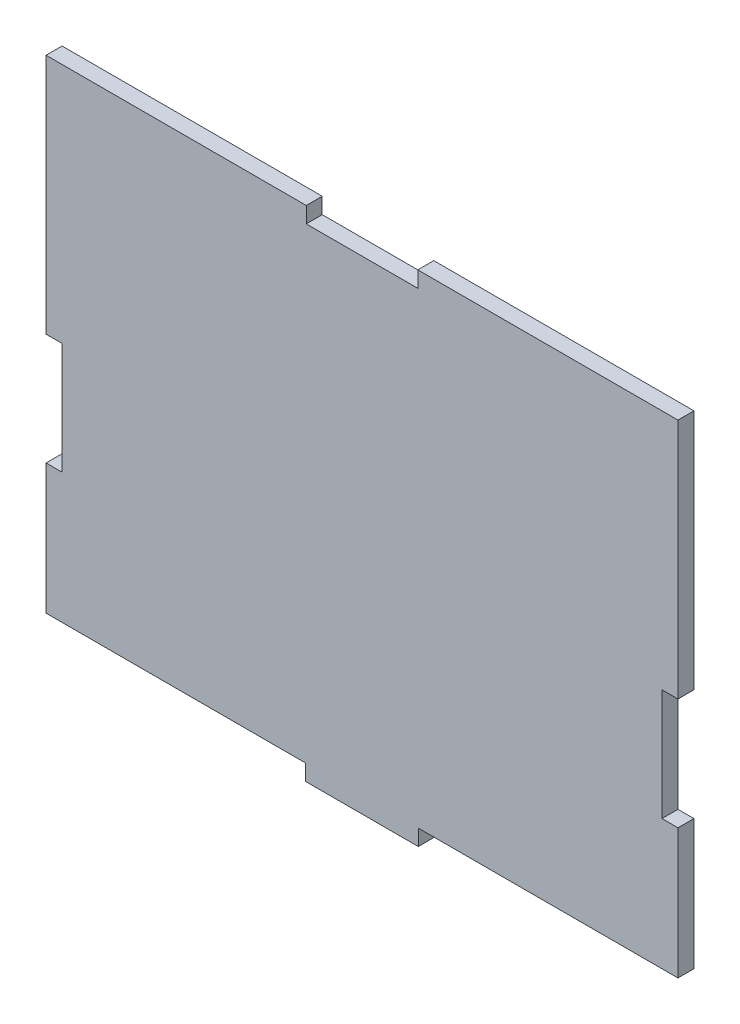
ISO-10303-21;
HEADER;
FILE_DESCRIPTION(('STEP AP214'),'2;1');
FILE_NAME('part.step','',(''),(''),'','','');
FILE_SCHEMA(('AUTOMOTIVE_DESIGN { 1 0 10303 214 1 1 1 1 }'));
ENDSEC;
DATA;
#1=APPLICATION_CONTEXT('core data for automotive mechanical design processes');
#2=APPLICATION_PROTOCOL_DEFINITION('international standard','automotive_design',2000,#1);
#3=PRODUCT_CONTEXT('',#1,'mechanical');
#4=PRODUCT('Part','Part','',(#3));
#5=PRODUCT_RELATED_PRODUCT_CATEGORY('part','',(#4));
#6=PRODUCT_DEFINITION_FORMATION('','',#4);
#7=PRODUCT_DEFINITION_CONTEXT('part definition',#1,'design');
#8=PRODUCT_DEFINITION('design','',#6,#7);
#9=PRODUCT_DEFINITION_SHAPE('','',#8);
#10=(LENGTH_UNIT() NAMED_UNIT(*) SI_UNIT(.MILLI.,.METRE.));
#11=(NAMED_UNIT(*) PLANE_ANGLE_UNIT() SI_UNIT($,.RADIAN.));
#12=(NAMED_UNIT(*) SI_UNIT($,.STERADIAN.) SOLID_ANGLE_UNIT());
#13=UNCERTAINTY_MEASURE_WITH_UNIT(LENGTH_MEASURE(1.E-05),#10,'distance_accuracy_value','');
#14=(GEOMETRIC_REPRESENTATION_CONTEXT(3) GLOBAL_UNCERTAINTY_ASSIGNED_CONTEXT((#13)) GLOBAL_UNIT_ASSIGNED_CONTEXT((#10,
#11,#12)) REPRESENTATION_CONTEXT('',''));
#15=CARTESIAN_POINT('',(0.,0.,0.));
#16=DIRECTION('',(0.,0.,1.));
#17=DIRECTION('',(1.,0.,0.));
#18=AXIS2_PLACEMENT_3D('',#15,#16,#17);
#19=CARTESIAN_POINT('',(85.,0.,4.3));
#20=DIRECTION('',(-1.,0.,0.));
#21=DIRECTION('',(0.,-1.,0.));
#22=AXIS2_PLACEMENT_3D('',#19,#20,#21);
#23=PLANE('',#22);
#24=DIRECTION('',(0.,1.,0.));
#25=VECTOR('',#24,1.);
#26=CARTESIAN_POINT('',(85.,0.,0.));
#27=LINE('',#26,#25);
#28=CARTESIAN_POINT('',(85.,0.,0.));
#29=VERTEX_POINT('',#28);
#30=CARTESIAN_POINT('',(85.,65.,0.));
#31=VERTEX_POINT('',#30);
#32=EDGE_CURVE('E204',#29,#31,#27,.T.);
#33=ORIENTED_EDGE('',*,*,#32,.T.);
#34=DIRECTION('',(0.,0.,-1.));
#35=VECTOR('',#34,1.);
#36=CARTESIAN_POINT('',(85.,65.,4.3));
#37=LINE('',#36,#35);
#38=CARTESIAN_POINT('',(85.,65.,4.3));
#39=VERTEX_POINT('',#38);
#40=EDGE_CURVE('E11',#39,#31,#37,.T.);
#41=ORIENTED_EDGE('',*,*,#40,.F.);
#42=DIRECTION('',(0.,1.,0.));
#43=VECTOR('',#42,1.);
#44=CARTESIAN_POINT('',(85.,0.,4.3));
#45=LINE('',#44,#43);
#46=CARTESIAN_POINT('',(85.,0.,4.3));
#47=VERTEX_POINT('',#46);
#48=EDGE_CURVE('E242',#47,#39,#45,.T.);
#49=ORIENTED_EDGE('',*,*,#48,.F.);
#50=DIRECTION('',(0.,0.,-1.));
#51=VECTOR('',#50,1.);
#52=CARTESIAN_POINT('',(85.,0.,4.3));
#53=LINE('',#52,#51);
#54=EDGE_CURVE('E200',#47,#29,#53,.T.);
#55=ORIENTED_EDGE('',*,*,#54,.T.);
#56=EDGE_LOOP('',(#33,#41,#49,#55));
#57=FACE_BOUND('',#56,.T.);
#58=ADVANCED_FACE('F36',(#57),#23,.F.);
#59=CARTESIAN_POINT('',(15.,65.,4.3));
#60=DIRECTION('',(0.,-1.,0.));
#61=DIRECTION('',(0.,0.,-1.));
#62=AXIS2_PLACEMENT_3D('',#59,#60,#61);
#63=PLANE('',#62);
#64=DIRECTION('',(-1.,0.,0.));
#65=VECTOR('',#64,1.);
#66=CARTESIAN_POINT('',(15.,65.,0.));
#67=LINE('',#66,#65);
#68=CARTESIAN_POINT('',(15.,65.,0.));
#69=VERTEX_POINT('',#68);
#70=EDGE_CURVE('E207',#31,#69,#67,.T.);
#71=ORIENTED_EDGE('',*,*,#70,.T.);
#72=DIRECTION('',(0.,0.,-1.));
#73=VECTOR('',#72,1.);
#74=CARTESIAN_POINT('',(15.,65.,4.3));
#75=LINE('',#74,#73);
#76=CARTESIAN_POINT('',(15.,65.,4.3));
#77=VERTEX_POINT('',#76);
#78=EDGE_CURVE('E44',#77,#69,#75,.T.);
#79=ORIENTED_EDGE('',*,*,#78,.F.);
#80=DIRECTION('',(-1.,0.,0.));
#81=VECTOR('',#80,1.);
#82=CARTESIAN_POINT('',(15.,65.,4.3));
#83=LINE('',#82,#81);
#84=EDGE_CURVE('E131',#39,#77,#83,.T.);
#85=ORIENTED_EDGE('',*,*,#84,.F.);
#86=ORIENTED_EDGE('',*,*,#40,.T.);
#87=EDGE_LOOP('',(#71,#79,#85,#86));
#88=FACE_BOUND('',#87,.T.);
#89=ADVANCED_FACE('F360',(#88),#63,.F.);
#90=CARTESIAN_POINT('',(15.,65.,4.3));
#91=DIRECTION('',(1.,0.,0.));
#92=DIRECTION('',(0.,0.,-1.));
#93=AXIS2_PLACEMENT_3D('',#90,#91,#92);
#94=PLANE('',#93);
#95=DIRECTION('',(0.,-1.,0.));
#96=VECTOR('',#95,1.);
#97=CARTESIAN_POINT('',(15.,65.,0.));
#98=LINE('',#97,#96);
#99=CARTESIAN_POINT('',(15.,60.7,0.));
#100=VERTEX_POINT('',#99);
#101=EDGE_CURVE('E209',#69,#100,#98,.T.);
#102=ORIENTED_EDGE('',*,*,#101,.T.);
#103=DIRECTION('',(0.,0.,-1.));
#104=VECTOR('',#103,1.);
#105=CARTESIAN_POINT('',(15.,60.7,4.3));
#106=LINE('',#105,#104);
#107=CARTESIAN_POINT('',(15.,60.7,4.3));
#108=VERTEX_POINT('',#107);
#109=EDGE_CURVE('E285',#108,#100,#106,.T.);
#110=ORIENTED_EDGE('',*,*,#109,.F.);
#111=DIRECTION('',(0.,-1.,0.));
#112=VECTOR('',#111,1.);
#113=CARTESIAN_POINT('',(15.,65.,4.3));
#114=LINE('',#113,#112);
#115=EDGE_CURVE('E293',#77,#108,#114,.T.);
#116=ORIENTED_EDGE('',*,*,#115,.F.);
#117=ORIENTED_EDGE('',*,*,#78,.T.);
#118=EDGE_LOOP('',(#102,#110,#116,#117));
#119=FACE_BOUND('',#118,.T.);
#120=ADVANCED_FACE('F291',(#119),#94,.F.);
#121=CARTESIAN_POINT('',(15.,60.7,4.3));
#122=DIRECTION('',(0.,-1.,0.));
#123=DIRECTION('',(0.,0.,-1.));
#124=AXIS2_PLACEMENT_3D('',#121,#122,#123);
#125=PLANE('',#124);
#126=DIRECTION('',(-1.,0.,0.));
#127=VECTOR('',#126,1.);
#128=CARTESIAN_POINT('',(15.,60.7,0.));
#129=LINE('',#128,#127);
#130=CARTESIAN_POINT('',(-15.,60.7,0.));
#131=VERTEX_POINT('',#130);
#132=EDGE_CURVE('E211',#100,#131,#129,.T.);
#133=ORIENTED_EDGE('',*,*,#132,.T.);
#134=DIRECTION('',(0.,0.,-1.));
#135=VECTOR('',#134,1.);
#136=CARTESIAN_POINT('',(-15.,60.7,4.3));
#137=LINE('',#136,#135);
#138=CARTESIAN_POINT('',(-15.,60.7,4.3));
#139=VERTEX_POINT('',#138);
#140=EDGE_CURVE('E282',#139,#131,#137,.T.);
#141=ORIENTED_EDGE('',*,*,#140,.F.);
#142=DIRECTION('',(-1.,0.,0.));
#143=VECTOR('',#142,1.);
#144=CARTESIAN_POINT('',(15.,60.7,4.3));
#145=LINE('',#144,#143);
#146=EDGE_CURVE('E311',#108,#139,#145,.T.);
#147=ORIENTED_EDGE('',*,*,#146,.F.);
#148=ORIENTED_EDGE('',*,*,#109,.T.);
#149=EDGE_LOOP('',(#133,#141,#147,#148));
#150=FACE_BOUND('',#149,.T.);
#151=ADVANCED_FACE('F302',(#150),#125,.F.);
#152=CARTESIAN_POINT('',(-15.,65.,4.3));
#153=DIRECTION('',(-1.,0.,0.));
#154=DIRECTION('',(0.,0.,1.));
#155=AXIS2_PLACEMENT_3D('',#152,#153,#154);
#156=PLANE('',#155);
#157=DIRECTION('',(0.,1.,0.));
#158=VECTOR('',#157,1.);
#159=CARTESIAN_POINT('',(-15.,65.,0.));
#160=LINE('',#159,#158);
#161=CARTESIAN_POINT('',(-15.,65.,0.));
#162=VERTEX_POINT('',#161);
#163=EDGE_CURVE('E213',#131,#162,#160,.T.);
#164=ORIENTED_EDGE('',*,*,#163,.T.);
#165=DIRECTION('',(0.,0.,-1.));
#166=VECTOR('',#165,1.);
#167=CARTESIAN_POINT('',(-15.,65.,4.3));
#168=LINE('',#167,#166);
#169=CARTESIAN_POINT('',(-15.,65.,4.3));
#170=VERTEX_POINT('',#169);
#171=EDGE_CURVE('E279',#170,#162,#168,.T.);
#172=ORIENTED_EDGE('',*,*,#171,.F.);
#173=DIRECTION('',(0.,1.,0.));
#174=VECTOR('',#173,1.);
#175=CARTESIAN_POINT('',(-15.,65.,4.3));
#176=LINE('',#175,#174);
#177=EDGE_CURVE('E308',#139,#170,#176,.T.);
#178=ORIENTED_EDGE('',*,*,#177,.F.);
#179=ORIENTED_EDGE('',*,*,#140,.T.);
#180=EDGE_LOOP('',(#164,#172,#178,#179));
#181=FACE_BOUND('',#180,.T.);
#182=ADVANCED_FACE('F306',(#181),#156,.F.);
#183=CARTESIAN_POINT('',(-85.,65.,4.3));
#184=DIRECTION('',(0.,-1.,0.));
#185=DIRECTION('',(0.,0.,-1.));
#186=AXIS2_PLACEMENT_3D('',#183,#184,#185);
#187=PLANE('',#186);
#188=DIRECTION('',(-1.,0.,0.));
#189=VECTOR('',#188,1.);
#190=CARTESIAN_POINT('',(-85.,65.,0.));
#191=LINE('',#190,#189);
#192=CARTESIAN_POINT('',(-85.,65.,0.));
#193=VERTEX_POINT('',#192);
#194=EDGE_CURVE('E215',#162,#193,#191,.T.);
#195=ORIENTED_EDGE('',*,*,#194,.T.);
#196=DIRECTION('',(0.,0.,-1.));
#197=VECTOR('',#196,1.);
#198=CARTESIAN_POINT('',(-85.,65.,4.3));
#199=LINE('',#198,#197);
#200=CARTESIAN_POINT('',(-85.,65.,4.3));
#201=VERTEX_POINT('',#200);
#202=EDGE_CURVE('E276',#201,#193,#199,.T.);
#203=ORIENTED_EDGE('',*,*,#202,.F.);
#204=DIRECTION('',(-1.,0.,0.));
#205=VECTOR('',#204,1.);
#206=CARTESIAN_POINT('',(-85.,65.,4.3));
#207=LINE('',#206,#205);
#208=EDGE_CURVE('E310',#170,#201,#207,.T.);
#209=ORIENTED_EDGE('',*,*,#208,.F.);
#210=ORIENTED_EDGE('',*,*,#171,.T.);
#211=EDGE_LOOP('',(#195,#203,#209,#210));
#212=FACE_BOUND('',#211,.T.);
#213=ADVANCED_FACE('F373',(#212),#187,.F.);
#214=CARTESIAN_POINT('',(-85.,0.,4.3));
#215=DIRECTION('',(1.,0.,0.));
#216=DIRECTION('',(0.,1.,0.));
#217=AXIS2_PLACEMENT_3D('',#214,#215,#216);
#218=PLANE('',#217);
#219=DIRECTION('',(0.,-1.,0.));
#220=VECTOR('',#219,1.);
#221=CARTESIAN_POINT('',(-85.,0.,0.));
#222=LINE('',#221,#220);
#223=CARTESIAN_POINT('',(-85.,0.,0.));
#224=VERTEX_POINT('',#223);
#225=EDGE_CURVE('E217',#193,#224,#222,.T.);
#226=ORIENTED_EDGE('',*,*,#225,.T.);
#227=DIRECTION('',(0.,0.,-1.));
#228=VECTOR('',#227,1.);
#229=CARTESIAN_POINT('',(-85.,0.,4.3));
#230=LINE('',#229,#228);
#231=CARTESIAN_POINT('',(-85.,0.,4.3));
#232=VERTEX_POINT('',#231);
#233=EDGE_CURVE('E273',#232,#224,#230,.T.);
#234=ORIENTED_EDGE('',*,*,#233,.F.);
#235=DIRECTION('',(0.,-1.,0.));
#236=VECTOR('',#235,1.);
#237=CARTESIAN_POINT('',(-85.,0.,4.3));
#238=LINE('',#237,#236);
#239=EDGE_CURVE('E313',#201,#232,#238,.T.);
#240=ORIENTED_EDGE('',*,*,#239,.F.);
#241=ORIENTED_EDGE('',*,*,#202,.T.);
#242=EDGE_LOOP('',(#226,#234,#240,#241));
#243=FACE_BOUND('',#242,.T.);
#244=ADVANCED_FACE('F376',(#243),#218,.F.);
#245=CARTESIAN_POINT('',(-85.,0.,4.3));
#246=DIRECTION('',(0.,1.,0.));
#247=DIRECTION('',(0.,0.,1.));
#248=AXIS2_PLACEMENT_3D('',#245,#246,#247);
#249=PLANE('',#248);
#250=DIRECTION('',(1.,0.,0.));
#251=VECTOR('',#250,1.);
#252=CARTESIAN_POINT('',(-85.,0.,0.));
#253=LINE('',#252,#251);
#254=CARTESIAN_POINT('',(-80.7,0.,0.));
#255=VERTEX_POINT('',#254);
#256=EDGE_CURVE('E219',#224,#255,#253,.T.);
#257=ORIENTED_EDGE('',*,*,#256,.T.);
#258=DIRECTION('',(0.,0.,-1.));
#259=VECTOR('',#258,1.);
#260=CARTESIAN_POINT('',(-80.7,0.,4.3));
#261=LINE('',#260,#259);
#262=CARTESIAN_POINT('',(-80.7,0.,4.3));
#263=VERTEX_POINT('',#262);
#264=EDGE_CURVE('E270',#263,#255,#261,.T.);
#265=ORIENTED_EDGE('',*,*,#264,.F.);
#266=DIRECTION('',(1.,0.,0.));
#267=VECTOR('',#266,1.);
#268=CARTESIAN_POINT('',(-85.,0.,4.3));
#269=LINE('',#268,#267);
#270=EDGE_CURVE('E319',#232,#263,#269,.T.);
#271=ORIENTED_EDGE('',*,*,#270,.F.);
#272=ORIENTED_EDGE('',*,*,#233,.T.);
#273=EDGE_LOOP('',(#257,#265,#271,#272));
#274=FACE_BOUND('',#273,.T.);
#275=ADVANCED_FACE('F380',(#274),#249,.F.);
#276=CARTESIAN_POINT('',(-80.7,0.,4.3));
#277=DIRECTION('',(1.,0.,0.));
#278=DIRECTION('',(0.,0.,-1.));
#279=AXIS2_PLACEMENT_3D('',#276,#277,#278);
#280=PLANE('',#279);
#281=DIRECTION('',(0.,-1.,0.));
#282=VECTOR('',#281,1.);
#283=CARTESIAN_POINT('',(-80.7,0.,0.));
#284=LINE('',#283,#282);
#285=CARTESIAN_POINT('',(-80.7,-30.,0.));
#286=VERTEX_POINT('',#285);
#287=EDGE_CURVE('E221',#255,#286,#284,.T.);
#288=ORIENTED_EDGE('',*,*,#287,.T.);
#289=DIRECTION('',(0.,0.,-1.));
#290=VECTOR('',#289,1.);
#291=CARTESIAN_POINT('',(-80.7,-30.,4.3));
#292=LINE('',#291,#290);
#293=CARTESIAN_POINT('',(-80.7,-30.,4.3));
#294=VERTEX_POINT('',#293);
#295=EDGE_CURVE('E267',#294,#286,#292,.T.);
#296=ORIENTED_EDGE('',*,*,#295,.F.);
#297=DIRECTION('',(0.,-1.,0.));
#298=VECTOR('',#297,1.);
#299=CARTESIAN_POINT('',(-80.7,0.,4.3));
#300=LINE('',#299,#298);
#301=EDGE_CURVE('E321',#263,#294,#300,.T.);
#302=ORIENTED_EDGE('',*,*,#301,.F.);
#303=ORIENTED_EDGE('',*,*,#264,.T.);
#304=EDGE_LOOP('',(#288,#296,#302,#303));
#305=FACE_BOUND('',#304,.T.);
#306=ADVANCED_FACE('F384',(#305),#280,.F.);
#307=CARTESIAN_POINT('',(-85.,-30.,4.3));
#308=DIRECTION('',(0.,-1.,0.));
#309=DIRECTION('',(0.,0.,-1.));
#310=AXIS2_PLACEMENT_3D('',#307,#308,#309);
#311=PLANE('',#310);
#312=DIRECTION('',(-1.,0.,0.));
#313=VECTOR('',#312,1.);
#314=CARTESIAN_POINT('',(-85.,-30.,0.));
#315=LINE('',#314,#313);
#316=CARTESIAN_POINT('',(-85.,-30.,0.));
#317=VERTEX_POINT('',#316);
#318=EDGE_CURVE('E223',#286,#317,#315,.T.);
#319=ORIENTED_EDGE('',*,*,#318,.T.);
#320=DIRECTION('',(0.,0.,-1.));
#321=VECTOR('',#320,1.);
#322=CARTESIAN_POINT('',(-85.,-30.,4.3));
#323=LINE('',#322,#321);
#324=CARTESIAN_POINT('',(-85.,-30.,4.3));
#325=VERTEX_POINT('',#324);
#326=EDGE_CURVE('E264',#325,#317,#323,.T.);
#327=ORIENTED_EDGE('',*,*,#326,.F.);
#328=DIRECTION('',(-1.,0.,0.));
#329=VECTOR('',#328,1.);
#330=CARTESIAN_POINT('',(-85.,-30.,4.3));
#331=LINE('',#330,#329);
#332=EDGE_CURVE('E323',#294,#325,#331,.T.);
#333=ORIENTED_EDGE('',*,*,#332,.F.);
#334=ORIENTED_EDGE('',*,*,#295,.T.);
#335=EDGE_LOOP('',(#319,#327,#333,#334));
#336=FACE_BOUND('',#335,.T.);
#337=ADVANCED_FACE('F388',(#336),#311,.F.);
#338=CARTESIAN_POINT('',(-85.,-65.,4.3));
#339=DIRECTION('',(1.,0.,0.));
#340=DIRECTION('',(0.,1.,0.));
#341=AXIS2_PLACEMENT_3D('',#338,#339,#340);
#342=PLANE('',#341);
#343=DIRECTION('',(0.,-1.,0.));
#344=VECTOR('',#343,1.);
#345=CARTESIAN_POINT('',(-85.,-65.,0.));
#346=LINE('',#345,#344);
#347=CARTESIAN_POINT('',(-85.,-65.,0.));
#348=VERTEX_POINT('',#347);
#349=EDGE_CURVE('E225',#317,#348,#346,.T.);
#350=ORIENTED_EDGE('',*,*,#349,.T.);
#351=DIRECTION('',(0.,0.,-1.));
#352=VECTOR('',#351,1.);
#353=CARTESIAN_POINT('',(-85.,-65.,4.3));
#354=LINE('',#353,#352);
#355=CARTESIAN_POINT('',(-85.,-65.,4.3));
#356=VERTEX_POINT('',#355);
#357=EDGE_CURVE('E261',#356,#348,#354,.T.);
#358=ORIENTED_EDGE('',*,*,#357,.F.);
#359=DIRECTION('',(0.,-1.,0.));
#360=VECTOR('',#359,1.);
#361=CARTESIAN_POINT('',(-85.,-65.,4.3));
#362=LINE('',#361,#360);
#363=EDGE_CURVE('E325',#325,#356,#362,.T.);
#364=ORIENTED_EDGE('',*,*,#363,.F.);
#365=ORIENTED_EDGE('',*,*,#326,.T.);
#366=EDGE_LOOP('',(#350,#358,#364,#365));
#367=FACE_BOUND('',#366,.T.);
#368=ADVANCED_FACE('F392',(#367),#342,.F.);
#369=CARTESIAN_POINT('',(-85.,-65.,4.3));
#370=DIRECTION('',(0.,1.,0.));
#371=DIRECTION('',(0.,0.,1.));
#372=AXIS2_PLACEMENT_3D('',#369,#370,#371);
#373=PLANE('',#372);
#374=DIRECTION('',(1.,0.,0.));
#375=VECTOR('',#374,1.);
#376=CARTESIAN_POINT('',(-85.,-65.,0.));
#377=LINE('',#376,#375);
#378=CARTESIAN_POINT('',(-15.15,-65.,0.));
#379=VERTEX_POINT('',#378);
#380=EDGE_CURVE('E227',#348,#379,#377,.T.);
#381=ORIENTED_EDGE('',*,*,#380,.T.);
#382=DIRECTION('',(0.,0.,-1.));
#383=VECTOR('',#382,1.);
#384=CARTESIAN_POINT('',(-15.15,-65.,4.3));
#385=LINE('',#384,#383);
#386=CARTESIAN_POINT('',(-15.15,-65.,4.3));
#387=VERTEX_POINT('',#386);
#388=EDGE_CURVE('E258',#387,#379,#385,.T.);
#389=ORIENTED_EDGE('',*,*,#388,.F.);
#390=DIRECTION('',(1.,0.,0.));
#391=VECTOR('',#390,1.);
#392=CARTESIAN_POINT('',(-85.,-65.,4.3));
#393=LINE('',#392,#391);
#394=EDGE_CURVE('E327',#356,#387,#393,.T.);
#395=ORIENTED_EDGE('',*,*,#394,.F.);
#396=ORIENTED_EDGE('',*,*,#357,.T.);
#397=EDGE_LOOP('',(#381,#389,#395,#396));
#398=FACE_BOUND('',#397,.T.);
#399=ADVANCED_FACE('F396',(#398),#373,.F.);
#400=CARTESIAN_POINT('',(-15.15,-65.,4.3));
#401=DIRECTION('',(1.,0.,0.));
#402=DIRECTION('',(0.,0.,-1.));
#403=AXIS2_PLACEMENT_3D('',#400,#401,#402);
#404=PLANE('',#403);
#405=DIRECTION('',(0.,-1.,0.));
#406=VECTOR('',#405,1.);
#407=CARTESIAN_POINT('',(-15.15,-65.,0.));
#408=LINE('',#407,#406);
#409=CARTESIAN_POINT('',(-15.15,-69.3,0.));
#410=VERTEX_POINT('',#409);
#411=EDGE_CURVE('E229',#379,#410,#408,.T.);
#412=ORIENTED_EDGE('',*,*,#411,.T.);
#413=DIRECTION('',(0.,0.,-1.));
#414=VECTOR('',#413,1.);
#415=CARTESIAN_POINT('',(-15.15,-69.3,4.3));
#416=LINE('',#415,#414);
#417=CARTESIAN_POINT('',(-15.15,-69.3,4.3));
#418=VERTEX_POINT('',#417);
#419=EDGE_CURVE('E255',#418,#410,#416,.T.);
#420=ORIENTED_EDGE('',*,*,#419,.F.);
#421=DIRECTION('',(0.,-1.,0.));
#422=VECTOR('',#421,1.);
#423=CARTESIAN_POINT('',(-15.15,-65.,4.3));
#424=LINE('',#423,#422);
#425=EDGE_CURVE('E329',#387,#418,#424,.T.);
#426=ORIENTED_EDGE('',*,*,#425,.F.);
#427=ORIENTED_EDGE('',*,*,#388,.T.);
#428=EDGE_LOOP('',(#412,#420,#426,#427));
#429=FACE_BOUND('',#428,.T.);
#430=ADVANCED_FACE('F400',(#429),#404,.F.);
#431=CARTESIAN_POINT('',(15.15,-69.3,4.3));
#432=DIRECTION('',(0.,1.,0.));
#433=DIRECTION('',(0.,0.,1.));
#434=AXIS2_PLACEMENT_3D('',#431,#432,#433);
#435=PLANE('',#434);
#436=DIRECTION('',(1.,0.,0.));
#437=VECTOR('',#436,1.);
#438=CARTESIAN_POINT('',(15.15,-69.3,0.));
#439=LINE('',#438,#437);
#440=CARTESIAN_POINT('',(15.15,-69.3,0.));
#441=VERTEX_POINT('',#440);
#442=EDGE_CURVE('E231',#410,#441,#439,.T.);
#443=ORIENTED_EDGE('',*,*,#442,.T.);
#444=DIRECTION('',(0.,0.,-1.));
#445=VECTOR('',#444,1.);
#446=CARTESIAN_POINT('',(15.15,-69.3,4.3));
#447=LINE('',#446,#445);
#448=CARTESIAN_POINT('',(15.15,-69.3,4.3));
#449=VERTEX_POINT('',#448);
#450=EDGE_CURVE('E252',#449,#441,#447,.T.);
#451=ORIENTED_EDGE('',*,*,#450,.F.);
#452=DIRECTION('',(1.,0.,0.));
#453=VECTOR('',#452,1.);
#454=CARTESIAN_POINT('',(15.15,-69.3,4.3));
#455=LINE('',#454,#453);
#456=EDGE_CURVE('E331',#418,#449,#455,.T.);
#457=ORIENTED_EDGE('',*,*,#456,.F.);
#458=ORIENTED_EDGE('',*,*,#419,.T.);
#459=EDGE_LOOP('',(#443,#451,#457,#458));
#460=FACE_BOUND('',#459,.T.);
#461=ADVANCED_FACE('F404',(#460),#435,.F.);
#462=CARTESIAN_POINT('',(15.15,-65.,4.3));
#463=DIRECTION('',(-1.,0.,0.));
#464=DIRECTION('',(0.,0.,1.));
#465=AXIS2_PLACEMENT_3D('',#462,#463,#464);
#466=PLANE('',#465);
#467=DIRECTION('',(0.,1.,0.));
#468=VECTOR('',#467,1.);
#469=CARTESIAN_POINT('',(15.15,-65.,0.));
#470=LINE('',#469,#468);
#471=CARTESIAN_POINT('',(15.15,-65.,0.));
#472=VERTEX_POINT('',#471);
#473=EDGE_CURVE('E233',#441,#472,#470,.T.);
#474=ORIENTED_EDGE('',*,*,#473,.T.);
#475=DIRECTION('',(0.,0.,-1.));
#476=VECTOR('',#475,1.);
#477=CARTESIAN_POINT('',(15.15,-65.,4.3));
#478=LINE('',#477,#476);
#479=CARTESIAN_POINT('',(15.15,-65.,4.3));
#480=VERTEX_POINT('',#479);
#481=EDGE_CURVE('E249',#480,#472,#478,.T.);
#482=ORIENTED_EDGE('',*,*,#481,.F.);
#483=DIRECTION('',(0.,1.,0.));
#484=VECTOR('',#483,1.);
#485=CARTESIAN_POINT('',(15.15,-65.,4.3));
#486=LINE('',#485,#484);
#487=EDGE_CURVE('E333',#449,#480,#486,.T.);
#488=ORIENTED_EDGE('',*,*,#487,.F.);
#489=ORIENTED_EDGE('',*,*,#450,.T.);
#490=EDGE_LOOP('',(#474,#482,#488,#489));
#491=FACE_BOUND('',#490,.T.);
#492=ADVANCED_FACE('F408',(#491),#466,.F.);
#493=CARTESIAN_POINT('',(15.15,-65.,4.3));
#494=DIRECTION('',(0.,1.,0.));
#495=DIRECTION('',(0.,0.,1.));
#496=AXIS2_PLACEMENT_3D('',#493,#494,#495);
#497=PLANE('',#496);
#498=DIRECTION('',(1.,0.,0.));
#499=VECTOR('',#498,1.);
#500=CARTESIAN_POINT('',(15.15,-65.,0.));
#501=LINE('',#500,#499);
#502=CARTESIAN_POINT('',(85.,-65.,0.));
#503=VERTEX_POINT('',#502);
#504=EDGE_CURVE('E235',#472,#503,#501,.T.);
#505=ORIENTED_EDGE('',*,*,#504,.T.);
#506=DIRECTION('',(0.,0.,-1.));
#507=VECTOR('',#506,1.);
#508=CARTESIAN_POINT('',(85.,-65.,4.3));
#509=LINE('',#508,#507);
#510=CARTESIAN_POINT('',(85.,-65.,4.3));
#511=VERTEX_POINT('',#510);
#512=EDGE_CURVE('E246',#511,#503,#509,.T.);
#513=ORIENTED_EDGE('',*,*,#512,.F.);
#514=DIRECTION('',(1.,0.,0.));
#515=VECTOR('',#514,1.);
#516=CARTESIAN_POINT('',(15.15,-65.,4.3));
#517=LINE('',#516,#515);
#518=EDGE_CURVE('E335',#480,#511,#517,.T.);
#519=ORIENTED_EDGE('',*,*,#518,.F.);
#520=ORIENTED_EDGE('',*,*,#481,.T.);
#521=EDGE_LOOP('',(#505,#513,#519,#520));
#522=FACE_BOUND('',#521,.T.);
#523=ADVANCED_FACE('F341',(#522),#497,.F.);
#524=CARTESIAN_POINT('',(85.,-65.,4.3));
#525=DIRECTION('',(-1.,0.,0.));
#526=DIRECTION('',(0.,-1.,0.));
#527=AXIS2_PLACEMENT_3D('',#524,#525,#526);
#528=PLANE('',#527);
#529=DIRECTION('',(0.,1.,0.));
#530=VECTOR('',#529,1.);
#531=CARTESIAN_POINT('',(85.,-65.,0.));
#532=LINE('',#531,#530);
#533=CARTESIAN_POINT('',(85.,-30.,0.));
#534=VERTEX_POINT('',#533);
#535=EDGE_CURVE('E237',#503,#534,#532,.T.);
#536=ORIENTED_EDGE('',*,*,#535,.T.);
#537=DIRECTION('',(0.,0.,-1.));
#538=VECTOR('',#537,1.);
#539=CARTESIAN_POINT('',(85.,-30.,4.3));
#540=LINE('',#539,#538);
#541=CARTESIAN_POINT('',(85.,-30.,4.3));
#542=VERTEX_POINT('',#541);
#543=EDGE_CURVE('E195',#542,#534,#540,.T.);
#544=ORIENTED_EDGE('',*,*,#543,.F.);
#545=DIRECTION('',(0.,1.,0.));
#546=VECTOR('',#545,1.);
#547=CARTESIAN_POINT('',(85.,-65.,4.3));
#548=LINE('',#547,#546);
#549=EDGE_CURVE('E186',#511,#542,#548,.T.);
#550=ORIENTED_EDGE('',*,*,#549,.F.);
#551=ORIENTED_EDGE('',*,*,#512,.T.);
#552=EDGE_LOOP('',(#536,#544,#550,#551));
#553=FACE_BOUND('',#552,.T.);
#554=ADVANCED_FACE('F345',(#553),#528,.F.);
#555=CARTESIAN_POINT('',(85.,-30.,4.3));
#556=DIRECTION('',(0.,-1.,0.));
#557=DIRECTION('',(0.,0.,-1.));
#558=AXIS2_PLACEMENT_3D('',#555,#556,#557);
#559=PLANE('',#558);
#560=DIRECTION('',(-1.,0.,0.));
#561=VECTOR('',#560,1.);
#562=CARTESIAN_POINT('',(85.,-30.,0.));
#563=LINE('',#562,#561);
#564=CARTESIAN_POINT('',(80.7,-30.,0.));
#565=VERTEX_POINT('',#564);
#566=EDGE_CURVE('E194',#534,#565,#563,.T.);
#567=ORIENTED_EDGE('',*,*,#566,.T.);
#568=DIRECTION('',(0.,0.,-1.));
#569=VECTOR('',#568,1.);
#570=CARTESIAN_POINT('',(80.7,-30.,4.3));
#571=LINE('',#570,#569);
#572=CARTESIAN_POINT('',(80.7,-30.,4.3));
#573=VERTEX_POINT('',#572);
#574=EDGE_CURVE('E191',#573,#565,#571,.T.);
#575=ORIENTED_EDGE('',*,*,#574,.F.);
#576=DIRECTION('',(-1.,0.,0.));
#577=VECTOR('',#576,1.);
#578=CARTESIAN_POINT('',(85.,-30.,4.3));
#579=LINE('',#578,#577);
#580=EDGE_CURVE('E180',#542,#573,#579,.T.);
#581=ORIENTED_EDGE('',*,*,#580,.F.);
#582=ORIENTED_EDGE('',*,*,#543,.T.);
#583=EDGE_LOOP('',(#567,#575,#581,#582));
#584=FACE_BOUND('',#583,.T.);
#585=ADVANCED_FACE('F192',(#584),#559,.F.);
#586=CARTESIAN_POINT('',(80.7,0.,4.3));
#587=DIRECTION('',(-1.,0.,0.));
#588=DIRECTION('',(0.,0.,1.));
#589=AXIS2_PLACEMENT_3D('',#586,#587,#588);
#590=PLANE('',#589);
#591=DIRECTION('',(0.,1.,0.));
#592=VECTOR('',#591,1.);
#593=CARTESIAN_POINT('',(80.7,0.,0.));
#594=LINE('',#593,#592);
#595=CARTESIAN_POINT('',(80.7,0.,0.));
#596=VERTEX_POINT('',#595);
#597=EDGE_CURVE('E117',#565,#596,#594,.T.);
#598=ORIENTED_EDGE('',*,*,#597,.T.);
#599=DIRECTION('',(0.,0.,-1.));
#600=VECTOR('',#599,1.);
#601=CARTESIAN_POINT('',(80.7,0.,4.3));
#602=LINE('',#601,#600);
#603=CARTESIAN_POINT('',(80.7,0.,4.3));
#604=VERTEX_POINT('',#603);
#605=EDGE_CURVE('E196',#604,#596,#602,.T.);
#606=ORIENTED_EDGE('',*,*,#605,.F.);
#607=DIRECTION('',(0.,1.,0.));
#608=VECTOR('',#607,1.);
#609=CARTESIAN_POINT('',(80.7,0.,4.3));
#610=LINE('',#609,#608);
#611=EDGE_CURVE('E184',#573,#604,#610,.T.);
#612=ORIENTED_EDGE('',*,*,#611,.F.);
#613=ORIENTED_EDGE('',*,*,#574,.T.);
#614=EDGE_LOOP('',(#598,#606,#612,#613));
#615=FACE_BOUND('',#614,.T.);
#616=ADVANCED_FACE('F198',(#615),#590,.F.);
#617=CARTESIAN_POINT('',(85.,0.,4.3));
#618=DIRECTION('',(0.,1.,0.));
#619=DIRECTION('',(-1.,0.,0.));
#620=AXIS2_PLACEMENT_3D('',#617,#618,#619);
#621=PLANE('',#620);
#622=DIRECTION('',(1.,0.,0.));
#623=VECTOR('',#622,1.);
#624=CARTESIAN_POINT('',(85.,0.,0.));
#625=LINE('',#624,#623);
#626=EDGE_CURVE('E123',#596,#29,#625,.T.);
#627=ORIENTED_EDGE('',*,*,#626,.T.);
#628=ORIENTED_EDGE('',*,*,#54,.F.);
#629=DIRECTION('',(1.,0.,0.));
#630=VECTOR('',#629,1.);
#631=CARTESIAN_POINT('',(85.,0.,4.3));
#632=LINE('',#631,#630);
#633=EDGE_CURVE('E52',#604,#47,#632,.T.);
#634=ORIENTED_EDGE('',*,*,#633,.F.);
#635=ORIENTED_EDGE('',*,*,#605,.T.);
#636=EDGE_LOOP('',(#627,#628,#634,#635));
#637=FACE_BOUND('',#636,.T.);
#638=ADVANCED_FACE('F349',(#637),#621,.F.);
#639=CARTESIAN_POINT('',(0.,0.,4.3));
#640=DIRECTION('',(0.,0.,-1.));
#641=DIRECTION('',(-1.,0.,0.));
#642=AXIS2_PLACEMENT_3D('',#639,#640,#641);
#643=PLANE('',#642);
#644=ORIENTED_EDGE('',*,*,#48,.T.);
#645=ORIENTED_EDGE('',*,*,#84,.T.);
#646=ORIENTED_EDGE('',*,*,#115,.T.);
#647=ORIENTED_EDGE('',*,*,#146,.T.);
#648=ORIENTED_EDGE('',*,*,#177,.T.);
#649=ORIENTED_EDGE('',*,*,#208,.T.);
#650=ORIENTED_EDGE('',*,*,#239,.T.);
#651=ORIENTED_EDGE('',*,*,#270,.T.);
#652=ORIENTED_EDGE('',*,*,#301,.T.);
#653=ORIENTED_EDGE('',*,*,#332,.T.);
#654=ORIENTED_EDGE('',*,*,#363,.T.);
#655=ORIENTED_EDGE('',*,*,#394,.T.);
#656=ORIENTED_EDGE('',*,*,#425,.T.);
#657=ORIENTED_EDGE('',*,*,#456,.T.);
#658=ORIENTED_EDGE('',*,*,#487,.T.);
#659=ORIENTED_EDGE('',*,*,#518,.T.);
#660=ORIENTED_EDGE('',*,*,#549,.T.);
#661=ORIENTED_EDGE('',*,*,#580,.T.);
#662=ORIENTED_EDGE('',*,*,#611,.T.);
#663=ORIENTED_EDGE('',*,*,#633,.T.);
#664=EDGE_LOOP('',(#644,#645,#646,#647,#648,#649,#650,#651,#652,#653,#654,#655,#656,#657,#658,
#659,#660,#661,#662,#663));
#665=FACE_BOUND('',#664,.T.);
#666=ADVANCED_FACE('F182',(#665),#643,.F.);
#667=CARTESIAN_POINT('',(0.,0.,0.));
#668=DIRECTION('',(0.,0.,-1.));
#669=DIRECTION('',(-1.,0.,0.));
#670=AXIS2_PLACEMENT_3D('',#667,#668,#669);
#671=PLANE('',#670);
#672=ORIENTED_EDGE('',*,*,#32,.F.);
#673=ORIENTED_EDGE('',*,*,#626,.F.);
#674=ORIENTED_EDGE('',*,*,#597,.F.);
#675=ORIENTED_EDGE('',*,*,#566,.F.);
#676=ORIENTED_EDGE('',*,*,#535,.F.);
#677=ORIENTED_EDGE('',*,*,#504,.F.);
#678=ORIENTED_EDGE('',*,*,#473,.F.);
#679=ORIENTED_EDGE('',*,*,#442,.F.);
#680=ORIENTED_EDGE('',*,*,#411,.F.);
#681=ORIENTED_EDGE('',*,*,#380,.F.);
#682=ORIENTED_EDGE('',*,*,#349,.F.);
#683=ORIENTED_EDGE('',*,*,#318,.F.);
#684=ORIENTED_EDGE('',*,*,#287,.F.);
#685=ORIENTED_EDGE('',*,*,#256,.F.);
#686=ORIENTED_EDGE('',*,*,#225,.F.);
#687=ORIENTED_EDGE('',*,*,#194,.F.);
#688=ORIENTED_EDGE('',*,*,#163,.F.);
#689=ORIENTED_EDGE('',*,*,#132,.F.);
#690=ORIENTED_EDGE('',*,*,#101,.F.);
#691=ORIENTED_EDGE('',*,*,#70,.F.);
#692=EDGE_LOOP('',(#672,#673,#674,#675,#676,#677,#678,#679,#680,#681,#682,#683,#684,#685,#686,
#687,#688,#689,#690,#691));
#693=FACE_BOUND('',#692,.T.);
#694=ADVANCED_FACE('F297',(#693),#671,.T.);
#695=CLOSED_SHELL('',(#58,#89,#120,#151,#182,#213,#244,#275,#306,#337,#368,#399,#430,#461,#492,
#523,#554,#585,#616,#638,#666,#694));
#696=MANIFOLD_SOLID_BREP('B2',#695);
#697=ADVANCED_BREP_SHAPE_REPRESENTATION('',(#18,#696),#14);
#698=SHAPE_DEFINITION_REPRESENTATION(#9,#697);
ENDSEC;
END-ISO-10303-21;
